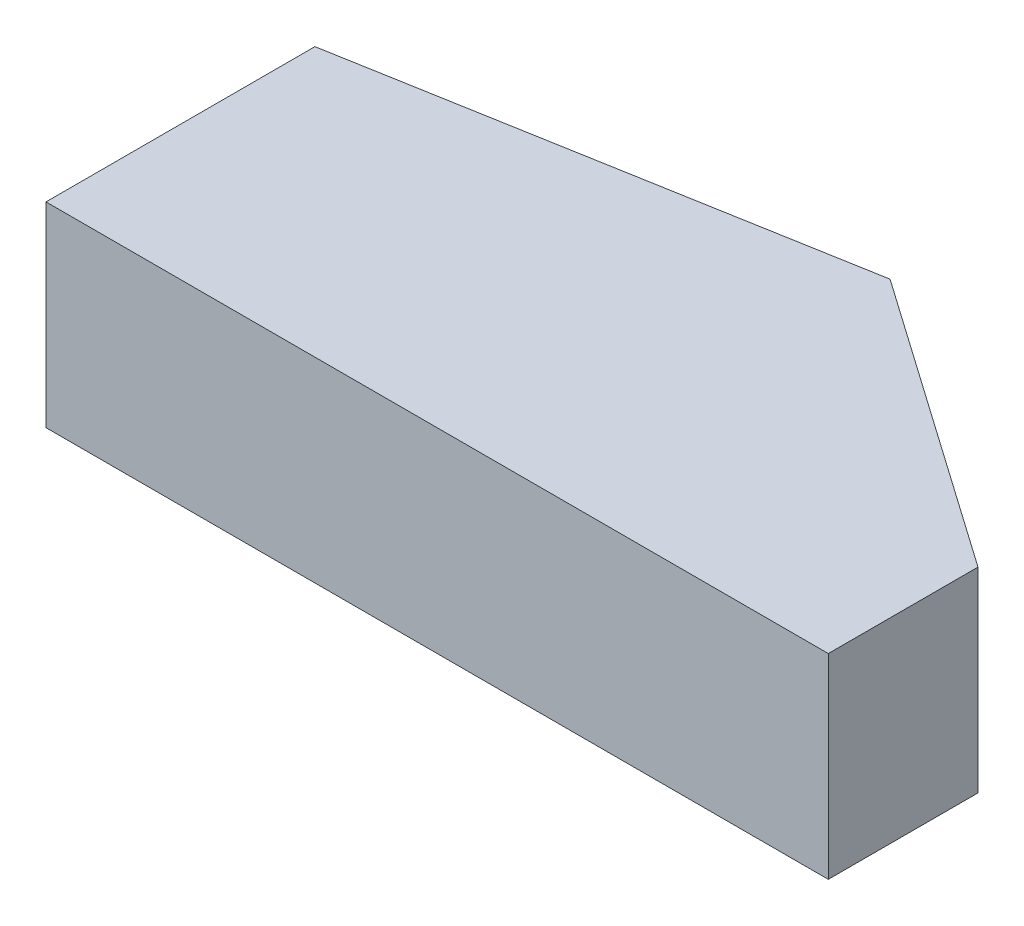
ISO-10303-21;
HEADER;
FILE_DESCRIPTION(('STEP AP214'),'2;1');
FILE_NAME('part.step','',(''),(''),'','','');
FILE_SCHEMA(('AUTOMOTIVE_DESIGN { 1 0 10303 214 1 1 1 1 }'));
ENDSEC;
DATA;
#1=APPLICATION_CONTEXT('core data for automotive mechanical design processes');
#2=APPLICATION_PROTOCOL_DEFINITION('international standard','automotive_design',2000,#1);
#3=PRODUCT_CONTEXT('',#1,'mechanical');
#4=PRODUCT('Part','Part','',(#3));
#5=PRODUCT_RELATED_PRODUCT_CATEGORY('part','',(#4));
#6=PRODUCT_DEFINITION_FORMATION('','',#4);
#7=PRODUCT_DEFINITION_CONTEXT('part definition',#1,'design');
#8=PRODUCT_DEFINITION('design','',#6,#7);
#9=PRODUCT_DEFINITION_SHAPE('','',#8);
#10=(LENGTH_UNIT() NAMED_UNIT(*) SI_UNIT(.MILLI.,.METRE.));
#11=(NAMED_UNIT(*) PLANE_ANGLE_UNIT() SI_UNIT($,.RADIAN.));
#12=(NAMED_UNIT(*) SI_UNIT($,.STERADIAN.) SOLID_ANGLE_UNIT());
#13=UNCERTAINTY_MEASURE_WITH_UNIT(LENGTH_MEASURE(1.E-05),#10,'distance_accuracy_value','');
#14=(GEOMETRIC_REPRESENTATION_CONTEXT(3) GLOBAL_UNCERTAINTY_ASSIGNED_CONTEXT((#13)) GLOBAL_UNIT_ASSIGNED_CONTEXT((#10,
#11,#12)) REPRESENTATION_CONTEXT('',''));
#15=CARTESIAN_POINT('',(0.,0.,0.));
#16=DIRECTION('',(0.,0.,1.));
#17=DIRECTION('',(1.,0.,0.));
#18=AXIS2_PLACEMENT_3D('',#15,#16,#17);
#19=CARTESIAN_POINT('',(0.,25.4,-34.925));
#20=DIRECTION('',(1.,0.,0.));
#21=DIRECTION('',(0.,0.,-1.));
#22=AXIS2_PLACEMENT_3D('',#19,#20,#21);
#23=PLANE('',#22);
#24=DIRECTION('',(0.,0.,1.));
#25=VECTOR('',#24,1.);
#26=CARTESIAN_POINT('',(0.,0.,-34.925));
#27=LINE('',#26,#25);
#28=CARTESIAN_POINT('',(0.,0.,-34.925));
#29=VERTEX_POINT('',#28);
#30=CARTESIAN_POINT('',(0.,0.,0.));
#31=VERTEX_POINT('',#30);
#32=EDGE_CURVE('E118',#29,#31,#27,.T.);
#33=ORIENTED_EDGE('',*,*,#32,.T.);
#34=DIRECTION('',(0.,-1.,0.));
#35=VECTOR('',#34,1.);
#36=CARTESIAN_POINT('',(0.,25.4,0.));
#37=LINE('',#36,#35);
#38=CARTESIAN_POINT('',(0.,25.4,0.));
#39=VERTEX_POINT('',#38);
#40=EDGE_CURVE('E11',#39,#31,#37,.T.);
#41=ORIENTED_EDGE('',*,*,#40,.F.);
#42=DIRECTION('',(0.,0.,1.));
#43=VECTOR('',#42,1.);
#44=CARTESIAN_POINT('',(0.,25.4,-34.925));
#45=LINE('',#44,#43);
#46=CARTESIAN_POINT('',(0.,25.4,-34.925));
#47=VERTEX_POINT('',#46);
#48=EDGE_CURVE('E131',#47,#39,#45,.T.);
#49=ORIENTED_EDGE('',*,*,#48,.F.);
#50=DIRECTION('',(0.,-1.,0.));
#51=VECTOR('',#50,1.);
#52=CARTESIAN_POINT('',(0.,25.4,-34.925));
#53=LINE('',#52,#51);
#54=EDGE_CURVE('E114',#47,#29,#53,.T.);
#55=ORIENTED_EDGE('',*,*,#54,.T.);
#56=EDGE_LOOP('',(#33,#41,#49,#55));
#57=FACE_BOUND('',#56,.T.);
#58=ADVANCED_FACE('F39',(#57),#23,.F.);
#59=CARTESIAN_POINT('',(0.,25.4,0.));
#60=DIRECTION('',(0.,0.,-1.));
#61=DIRECTION('',(-1.,0.,0.));
#62=AXIS2_PLACEMENT_3D('',#59,#60,#61);
#63=PLANE('',#62);
#64=DIRECTION('',(1.,0.,0.));
#65=VECTOR('',#64,1.);
#66=CARTESIAN_POINT('',(0.,0.,0.));
#67=LINE('',#66,#65);
#68=CARTESIAN_POINT('',(101.6,0.,0.));
#69=VERTEX_POINT('',#68);
#70=EDGE_CURVE('E122',#31,#69,#67,.T.);
#71=ORIENTED_EDGE('',*,*,#70,.T.);
#72=DIRECTION('',(0.,-1.,0.));
#73=VECTOR('',#72,1.);
#74=CARTESIAN_POINT('',(101.6,25.4,0.));
#75=LINE('',#74,#73);
#76=CARTESIAN_POINT('',(101.6,25.4,0.));
#77=VERTEX_POINT('',#76);
#78=EDGE_CURVE('E48',#77,#69,#75,.T.);
#79=ORIENTED_EDGE('',*,*,#78,.F.);
#80=DIRECTION('',(1.,0.,0.));
#81=VECTOR('',#80,1.);
#82=CARTESIAN_POINT('',(0.,25.4,0.));
#83=LINE('',#82,#81);
#84=EDGE_CURVE('E90',#39,#77,#83,.T.);
#85=ORIENTED_EDGE('',*,*,#84,.F.);
#86=ORIENTED_EDGE('',*,*,#40,.T.);
#87=EDGE_LOOP('',(#71,#79,#85,#86));
#88=FACE_BOUND('',#87,.T.);
#89=ADVANCED_FACE('F153',(#88),#63,.F.);
#90=CARTESIAN_POINT('',(101.6,25.4,0.));
#91=DIRECTION('',(-1.,0.,0.));
#92=DIRECTION('',(0.,0.,1.));
#93=AXIS2_PLACEMENT_3D('',#90,#91,#92);
#94=PLANE('',#93);
#95=DIRECTION('',(0.,0.,-1.));
#96=VECTOR('',#95,1.);
#97=CARTESIAN_POINT('',(101.6,0.,0.));
#98=LINE('',#97,#96);
#99=CARTESIAN_POINT('',(101.6,0.,-19.4438560691971));
#100=VERTEX_POINT('',#99);
#101=EDGE_CURVE('E106',#69,#100,#98,.T.);
#102=ORIENTED_EDGE('',*,*,#101,.T.);
#103=DIRECTION('',(0.,-1.,0.));
#104=VECTOR('',#103,1.);
#105=CARTESIAN_POINT('',(101.6,25.4,-19.4438560691971));
#106=LINE('',#105,#104);
#107=CARTESIAN_POINT('',(101.6,25.4,-19.4438560691971));
#108=VERTEX_POINT('',#107);
#109=EDGE_CURVE('E103',#108,#100,#106,.T.);
#110=ORIENTED_EDGE('',*,*,#109,.F.);
#111=DIRECTION('',(0.,0.,-1.));
#112=VECTOR('',#111,1.);
#113=CARTESIAN_POINT('',(101.6,25.4,0.));
#114=LINE('',#113,#112);
#115=EDGE_CURVE('E94',#77,#108,#114,.T.);
#116=ORIENTED_EDGE('',*,*,#115,.F.);
#117=ORIENTED_EDGE('',*,*,#78,.T.);
#118=EDGE_LOOP('',(#102,#110,#116,#117));
#119=FACE_BOUND('',#118,.T.);
#120=ADVANCED_FACE('F104',(#119),#94,.F.);
#121=CARTESIAN_POINT('',(101.6,25.4,-19.4438560691971));
#122=DIRECTION('',(-0.57357643635105,0.,0.819152044288989));
#123=DIRECTION('',(0.819152044288989,0.,0.57357643635105));
#124=AXIS2_PLACEMENT_3D('',#121,#122,#123);
#125=PLANE('',#124);
#126=DIRECTION('',(-0.819152044288989,0.,-0.57357643635105));
#127=VECTOR('',#126,1.);
#128=CARTESIAN_POINT('',(101.6,0.,-19.4438560691971));
#129=LINE('',#128,#127);
#130=CARTESIAN_POINT('',(63.5,0.,-46.1217632749873));
#131=VERTEX_POINT('',#130);
#132=EDGE_CURVE('E76',#100,#131,#129,.T.);
#133=ORIENTED_EDGE('',*,*,#132,.T.);
#134=DIRECTION('',(0.,-1.,0.));
#135=VECTOR('',#134,1.);
#136=CARTESIAN_POINT('',(63.5,25.4,-46.1217632749873));
#137=LINE('',#136,#135);
#138=CARTESIAN_POINT('',(63.5,25.4,-46.1217632749873));
#139=VERTEX_POINT('',#138);
#140=EDGE_CURVE('E108',#139,#131,#137,.T.);
#141=ORIENTED_EDGE('',*,*,#140,.F.);
#142=DIRECTION('',(-0.819152044288989,0.,-0.57357643635105));
#143=VECTOR('',#142,1.);
#144=CARTESIAN_POINT('',(101.6,25.4,-19.4438560691971));
#145=LINE('',#144,#143);
#146=EDGE_CURVE('E98',#108,#139,#145,.T.);
#147=ORIENTED_EDGE('',*,*,#146,.F.);
#148=ORIENTED_EDGE('',*,*,#109,.T.);
#149=EDGE_LOOP('',(#133,#141,#147,#148));
#150=FACE_BOUND('',#149,.T.);
#151=ADVANCED_FACE('F110',(#150),#125,.F.);
#152=CARTESIAN_POINT('',(63.5,25.4,-46.1217632749873));
#153=DIRECTION('',(0.173648177666927,0.,0.984807753012209));
#154=DIRECTION('',(0.984807753012209,0.,-0.173648177666927));
#155=AXIS2_PLACEMENT_3D('',#152,#153,#154);
#156=PLANE('',#155);
#157=DIRECTION('',(-0.984807753012209,0.,0.173648177666927));
#158=VECTOR('',#157,1.);
#159=CARTESIAN_POINT('',(63.5,0.,-46.1217632749873));
#160=LINE('',#159,#158);
#161=EDGE_CURVE('E82',#131,#29,#160,.T.);
#162=ORIENTED_EDGE('',*,*,#161,.T.);
#163=ORIENTED_EDGE('',*,*,#54,.F.);
#164=DIRECTION('',(-0.984807753012209,0.,0.173648177666927));
#165=VECTOR('',#164,1.);
#166=CARTESIAN_POINT('',(63.5,25.4,-46.1217632749873));
#167=LINE('',#166,#165);
#168=EDGE_CURVE('E56',#139,#47,#167,.T.);
#169=ORIENTED_EDGE('',*,*,#168,.F.);
#170=ORIENTED_EDGE('',*,*,#140,.T.);
#171=EDGE_LOOP('',(#162,#163,#169,#170));
#172=FACE_BOUND('',#171,.T.);
#173=ADVANCED_FACE('F142',(#172),#156,.F.);
#174=CARTESIAN_POINT('',(0.,25.4,0.));
#175=DIRECTION('',(0.,1.,0.));
#176=DIRECTION('',(0.,0.,1.));
#177=AXIS2_PLACEMENT_3D('',#174,#175,#176);
#178=PLANE('',#177);
#179=ORIENTED_EDGE('',*,*,#48,.T.);
#180=ORIENTED_EDGE('',*,*,#84,.T.);
#181=ORIENTED_EDGE('',*,*,#115,.T.);
#182=ORIENTED_EDGE('',*,*,#146,.T.);
#183=ORIENTED_EDGE('',*,*,#168,.T.);
#184=EDGE_LOOP('',(#179,#180,#181,#182,#183));
#185=FACE_BOUND('',#184,.T.);
#186=ADVANCED_FACE('F96',(#185),#178,.T.);
#187=CARTESIAN_POINT('',(0.,0.,0.));
#188=DIRECTION('',(0.,1.,0.));
#189=DIRECTION('',(0.,0.,1.));
#190=AXIS2_PLACEMENT_3D('',#187,#188,#189);
#191=PLANE('',#190);
#192=ORIENTED_EDGE('',*,*,#32,.F.);
#193=ORIENTED_EDGE('',*,*,#161,.F.);
#194=ORIENTED_EDGE('',*,*,#132,.F.);
#195=ORIENTED_EDGE('',*,*,#101,.F.);
#196=ORIENTED_EDGE('',*,*,#70,.F.);
#197=EDGE_LOOP('',(#192,#193,#194,#195,#196));
#198=FACE_BOUND('',#197,.T.);
#199=ADVANCED_FACE('F138',(#198),#191,.F.);
#200=CLOSED_SHELL('',(#58,#89,#120,#151,#173,#186,#199));
#201=MANIFOLD_SOLID_BREP('B2',#200);
#202=ADVANCED_BREP_SHAPE_REPRESENTATION('',(#18,#201),#14);
#203=SHAPE_DEFINITION_REPRESENTATION(#9,#202);
ENDSEC;
END-ISO-10303-21;
